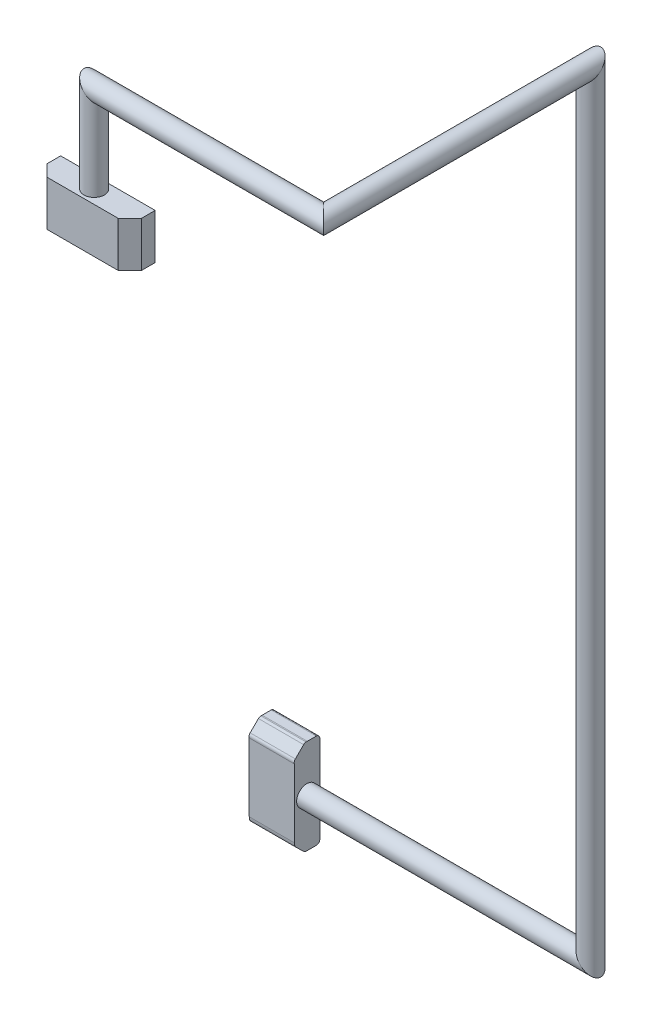
ISO-10303-21;
HEADER;
FILE_DESCRIPTION(('STEP AP214'),'2;1');
FILE_NAME('part.step','',(''),(''),'','','');
FILE_SCHEMA(('AUTOMOTIVE_DESIGN { 1 0 10303 214 1 1 1 1 }'));
ENDSEC;
DATA;
#1=APPLICATION_CONTEXT('core data for automotive mechanical design processes');
#2=APPLICATION_PROTOCOL_DEFINITION('international standard','automotive_design',2000,#1);
#3=PRODUCT_CONTEXT('',#1,'mechanical');
#4=PRODUCT('Part','Part','',(#3));
#5=PRODUCT_RELATED_PRODUCT_CATEGORY('part','',(#4));
#6=PRODUCT_DEFINITION_FORMATION('','',#4);
#7=PRODUCT_DEFINITION_CONTEXT('part definition',#1,'design');
#8=PRODUCT_DEFINITION('design','',#6,#7);
#9=PRODUCT_DEFINITION_SHAPE('','',#8);
#10=(LENGTH_UNIT() NAMED_UNIT(*) SI_UNIT(.MILLI.,.METRE.));
#11=(NAMED_UNIT(*) PLANE_ANGLE_UNIT() SI_UNIT($,.RADIAN.));
#12=(NAMED_UNIT(*) SI_UNIT($,.STERADIAN.) SOLID_ANGLE_UNIT());
#13=UNCERTAINTY_MEASURE_WITH_UNIT(LENGTH_MEASURE(1.E-05),#10,'distance_accuracy_value','');
#14=(GEOMETRIC_REPRESENTATION_CONTEXT(3) GLOBAL_UNCERTAINTY_ASSIGNED_CONTEXT((#13)) GLOBAL_UNIT_ASSIGNED_CONTEXT((#10,
#11,#12)) REPRESENTATION_CONTEXT('',''));
#15=CARTESIAN_POINT('',(0.,0.,0.));
#16=DIRECTION('',(0.,0.,1.));
#17=DIRECTION('',(1.,0.,0.));
#18=AXIS2_PLACEMENT_3D('',#15,#16,#17);
#19=CARTESIAN_POINT('',(3.95000000000001,57.485,19.48));
#20=DIRECTION('',(0.,-1.,0.));
#21=DIRECTION('',(0.,0.,-1.));
#22=AXIS2_PLACEMENT_3D('',#19,#20,#21);
#23=CYLINDRICAL_SURFACE('',#22,0.75);
#24=CARTESIAN_POINT('',(3.95000000000001,56.56,19.48));
#25=DIRECTION('',(-0.707106781186548,-0.707106781186548,0.));
#26=DIRECTION('',(-0.707106781186548,0.707106781186548,0.));
#27=AXIS2_PLACEMENT_3D('',#24,#25,#26);
#28=ELLIPSE('',#27,1.06066017177982,0.75);
#29=CARTESIAN_POINT('',(3.20000000000001,57.31,19.48));
#30=VERTEX_POINT('',#29);
#31=EDGE_CURVE('E243',#30,#30,#28,.F.);
#32=ORIENTED_EDGE('',*,*,#31,.F.);
#33=EDGE_LOOP('',(#32));
#34=FACE_BOUND('',#33,.T.);
#35=CARTESIAN_POINT('',(3.95000000000001,50.06,19.48));
#36=DIRECTION('',(0.,-1.,0.));
#37=DIRECTION('',(-1.,0.,0.));
#38=AXIS2_PLACEMENT_3D('',#35,#36,#37);
#39=CIRCLE('',#38,0.75);
#40=CARTESIAN_POINT('',(3.20000000000001,50.06,19.48));
#41=VERTEX_POINT('',#40);
#42=EDGE_CURVE('E46',#41,#41,#39,.T.);
#43=ORIENTED_EDGE('',*,*,#42,.F.);
#44=EDGE_LOOP('',(#43));
#45=FACE_BOUND('',#44,.T.);
#46=ADVANCED_FACE('F43',(#34,#45),#23,.T.);
#47=CARTESIAN_POINT('',(22.46,56.56,19.48));
#48=DIRECTION('',(-1.,0.,0.));
#49=DIRECTION('',(0.,0.,1.));
#50=AXIS2_PLACEMENT_3D('',#47,#48,#49);
#51=CYLINDRICAL_SURFACE('',#50,0.75);
#52=CARTESIAN_POINT('',(20.71,56.56,19.48));
#53=DIRECTION('',(-0.707106781186548,0.,0.707106781186547));
#54=DIRECTION('',(0.707106781186547,0.,0.707106781186548));
#55=AXIS2_PLACEMENT_3D('',#52,#53,#54);
#56=ELLIPSE('',#55,1.06066017177982,0.75);
#57=CARTESIAN_POINT('',(21.46,56.56,20.23));
#58=VERTEX_POINT('',#57);
#59=EDGE_CURVE('E241',#58,#58,#56,.F.);
#60=ORIENTED_EDGE('',*,*,#59,.F.);
#61=EDGE_LOOP('',(#60));
#62=FACE_BOUND('',#61,.T.);
#63=ORIENTED_EDGE('',*,*,#31,.T.);
#64=EDGE_LOOP('',(#63));
#65=FACE_BOUND('',#64,.T.);
#66=ADVANCED_FACE('F254',(#62,#65),#51,.T.);
#67=CARTESIAN_POINT('',(20.71,56.56,-0.924999999999992));
#68=DIRECTION('',(0.,0.,1.));
#69=DIRECTION('',(1.,0.,0.));
#70=AXIS2_PLACEMENT_3D('',#67,#68,#69);
#71=CYLINDRICAL_SURFACE('',#70,0.75);
#72=CARTESIAN_POINT('',(20.71,56.56,0.));
#73=DIRECTION('',(0.,0.707106781186548,0.707106781186548));
#74=DIRECTION('',(0.,0.707106781186548,-0.707106781186548));
#75=AXIS2_PLACEMENT_3D('',#72,#73,#74);
#76=ELLIPSE('',#75,1.06066017177982,0.75);
#77=CARTESIAN_POINT('',(20.71,57.31,-0.75));
#78=VERTEX_POINT('',#77);
#79=EDGE_CURVE('E52',#78,#78,#76,.F.);
#80=ORIENTED_EDGE('',*,*,#79,.F.);
#81=EDGE_LOOP('',(#80));
#82=FACE_BOUND('',#81,.T.);
#83=ORIENTED_EDGE('',*,*,#59,.T.);
#84=EDGE_LOOP('',(#83));
#85=FACE_BOUND('',#84,.T.);
#86=ADVANCED_FACE('F260',(#82,#85),#71,.T.);
#87=CARTESIAN_POINT('',(20.71,-1.75,0.));
#88=DIRECTION('',(0.,1.,0.));
#89=DIRECTION('',(0.,0.,1.));
#90=AXIS2_PLACEMENT_3D('',#87,#88,#89);
#91=CYLINDRICAL_SURFACE('',#90,0.75);
#92=CARTESIAN_POINT('',(20.71,0.,0.));
#93=DIRECTION('',(0.707106781186548,0.707106781186548,0.));
#94=DIRECTION('',(0.707106781186548,-0.707106781186548,0.));
#95=AXIS2_PLACEMENT_3D('',#92,#93,#94);
#96=ELLIPSE('',#95,1.06066017177982,0.75);
#97=CARTESIAN_POINT('',(21.46,-0.75,0.));
#98=VERTEX_POINT('',#97);
#99=EDGE_CURVE('E11',#98,#98,#96,.F.);
#100=ORIENTED_EDGE('',*,*,#99,.F.);
#101=EDGE_LOOP('',(#100));
#102=FACE_BOUND('',#101,.T.);
#103=ORIENTED_EDGE('',*,*,#79,.T.);
#104=EDGE_LOOP('',(#103));
#105=FACE_BOUND('',#104,.T.);
#106=ADVANCED_FACE('F267',(#102,#105),#91,.T.);
#107=CARTESIAN_POINT('',(0.,0.,0.));
#108=DIRECTION('',(1.,0.,0.));
#109=DIRECTION('',(0.,0.,-1.));
#110=AXIS2_PLACEMENT_3D('',#107,#108,#109);
#111=CYLINDRICAL_SURFACE('',#110,0.75);
#112=CARTESIAN_POINT('',(0.,0.,0.));
#113=DIRECTION('',(1.,0.,0.));
#114=DIRECTION('',(0.,0.,-1.));
#115=AXIS2_PLACEMENT_3D('',#112,#113,#114);
#116=CIRCLE('',#115,0.75);
#117=CARTESIAN_POINT('',(0.,0.,-0.75));
#118=VERTEX_POINT('',#117);
#119=EDGE_CURVE('E217',#118,#118,#116,.T.);
#120=ORIENTED_EDGE('',*,*,#119,.T.);
#121=EDGE_LOOP('',(#120));
#122=FACE_BOUND('',#121,.T.);
#123=ORIENTED_EDGE('',*,*,#99,.T.);
#124=EDGE_LOOP('',(#123));
#125=FACE_BOUND('',#124,.T.);
#126=ADVANCED_FACE('F264',(#122,#125),#111,.T.);
#127=CARTESIAN_POINT('',(-3.3,3.14279483130791,-0.674720463481326));
#128=DIRECTION('',(1.,0.,0.));
#129=DIRECTION('',(0.,0.,-1.));
#130=AXIS2_PLACEMENT_3D('',#127,#128,#129);
#131=CYLINDRICAL_SURFACE('',#130,0.268839190446714);
#132=CARTESIAN_POINT('',(0.,3.14279483130791,-0.674720463481326));
#133=DIRECTION('',(1.,0.,0.));
#134=DIRECTION('',(0.,0.,-1.));
#135=AXIS2_PLACEMENT_3D('',#132,#133,#134);
#136=CIRCLE('',#135,0.268839190446714);
#137=CARTESIAN_POINT('',(0.,3.14279483130791,-0.94355965392804));
#138=VERTEX_POINT('',#137);
#139=CARTESIAN_POINT('',(0.,3.41097312130053,-0.69355965392779));
#140=VERTEX_POINT('',#139);
#141=EDGE_CURVE('E178',#138,#140,#136,.T.);
#142=ORIENTED_EDGE('',*,*,#141,.F.);
#143=DIRECTION('',(1.,0.,0.));
#144=VECTOR('',#143,1.);
#145=CARTESIAN_POINT('',(-3.3,3.14279483130791,-0.94355965392804));
#146=LINE('',#145,#144);
#147=CARTESIAN_POINT('',(-3.3,3.14279483130791,-0.94355965392804));
#148=VERTEX_POINT('',#147);
#149=EDGE_CURVE('E61',#148,#138,#146,.T.);
#150=ORIENTED_EDGE('',*,*,#149,.F.);
#151=CARTESIAN_POINT('',(-3.3,3.14279483130791,-0.674720463481326));
#152=DIRECTION('',(1.,0.,0.));
#153=DIRECTION('',(0.,0.,-1.));
#154=AXIS2_PLACEMENT_3D('',#151,#152,#153);
#155=CIRCLE('',#154,0.268839190446714);
#156=CARTESIAN_POINT('',(-3.3,3.41097312130053,-0.69355965392779));
#157=VERTEX_POINT('',#156);
#158=EDGE_CURVE('E215',#148,#157,#155,.T.);
#159=ORIENTED_EDGE('',*,*,#158,.T.);
#160=DIRECTION('',(1.,0.,0.));
#161=VECTOR('',#160,1.);
#162=CARTESIAN_POINT('',(-3.3,3.41097312130053,-0.69355965392779));
#163=LINE('',#162,#161);
#164=EDGE_CURVE('E118',#157,#140,#163,.T.);
#165=ORIENTED_EDGE('',*,*,#164,.T.);
#166=EDGE_LOOP('',(#142,#150,#159,#165));
#167=FACE_BOUND('',#166,.T.);
#168=ADVANCED_FACE('F256',(#167),#131,.T.);
#169=CARTESIAN_POINT('',(-3.3,-3.2391993437757,-0.94355965392804));
#170=DIRECTION('',(0.,0.,-1.));
#171=DIRECTION('',(-1.,0.,0.));
#172=AXIS2_PLACEMENT_3D('',#169,#170,#171);
#173=PLANE('',#172);
#174=DIRECTION('',(0.,1.,0.));
#175=VECTOR('',#174,1.);
#176=CARTESIAN_POINT('',(0.,-3.2391993437757,-0.94355965392804));
#177=LINE('',#176,#175);
#178=CARTESIAN_POINT('',(0.,-3.2391993437757,-0.94355965392804));
#179=VERTEX_POINT('',#178);
#180=EDGE_CURVE('E212',#179,#138,#177,.T.);
#181=ORIENTED_EDGE('',*,*,#180,.F.);
#182=DIRECTION('',(1.,0.,0.));
#183=VECTOR('',#182,1.);
#184=CARTESIAN_POINT('',(-3.3,-3.2391993437757,-0.94355965392804));
#185=LINE('',#184,#183);
#186=CARTESIAN_POINT('',(-3.3,-3.2391993437757,-0.94355965392804));
#187=VERTEX_POINT('',#186);
#188=EDGE_CURVE('E106',#187,#179,#185,.T.);
#189=ORIENTED_EDGE('',*,*,#188,.F.);
#190=DIRECTION('',(0.,1.,0.));
#191=VECTOR('',#190,1.);
#192=CARTESIAN_POINT('',(-3.3,-3.2391993437757,-0.94355965392804));
#193=LINE('',#192,#191);
#194=EDGE_CURVE('E168',#187,#148,#193,.T.);
#195=ORIENTED_EDGE('',*,*,#194,.T.);
#196=ORIENTED_EDGE('',*,*,#149,.T.);
#197=EDGE_LOOP('',(#181,#189,#195,#196));
#198=FACE_BOUND('',#197,.T.);
#199=ADVANCED_FACE('F263',(#198),#173,.T.);
#200=CARTESIAN_POINT('',(-3.3,-3.2391993437757,-0.683559653928047));
#201=DIRECTION('',(1.,0.,0.));
#202=DIRECTION('',(0.,0.,-1.));
#203=AXIS2_PLACEMENT_3D('',#200,#201,#202);
#204=CYLINDRICAL_SURFACE('',#203,0.259999999999993);
#205=CARTESIAN_POINT('',(0.,-3.2391993437757,-0.683559653928047));
#206=DIRECTION('',(1.,0.,0.));
#207=DIRECTION('',(0.,0.,-1.));
#208=AXIS2_PLACEMENT_3D('',#205,#206,#207);
#209=CIRCLE('',#208,0.259999999999993);
#210=CARTESIAN_POINT('',(0.,-3.49919934377569,-0.683559653928047));
#211=VERTEX_POINT('',#210);
#212=EDGE_CURVE('E155',#211,#179,#209,.T.);
#213=ORIENTED_EDGE('',*,*,#212,.F.);
#214=DIRECTION('',(1.,0.,0.));
#215=VECTOR('',#214,1.);
#216=CARTESIAN_POINT('',(-3.3,-3.49919934377569,-0.683559653928047));
#217=LINE('',#216,#215);
#218=CARTESIAN_POINT('',(-3.3,-3.49919934377569,-0.683559653928047));
#219=VERTEX_POINT('',#218);
#220=EDGE_CURVE('E150',#219,#211,#217,.T.);
#221=ORIENTED_EDGE('',*,*,#220,.F.);
#222=CARTESIAN_POINT('',(-3.3,-3.2391993437757,-0.683559653928047));
#223=DIRECTION('',(1.,0.,0.));
#224=DIRECTION('',(0.,0.,-1.));
#225=AXIS2_PLACEMENT_3D('',#222,#223,#224);
#226=CIRCLE('',#225,0.259999999999993);
#227=EDGE_CURVE('E153',#219,#187,#226,.T.);
#228=ORIENTED_EDGE('',*,*,#227,.T.);
#229=ORIENTED_EDGE('',*,*,#188,.T.);
#230=EDGE_LOOP('',(#213,#221,#228,#229));
#231=FACE_BOUND('',#230,.T.);
#232=ADVANCED_FACE('F152',(#231),#204,.T.);
#233=CARTESIAN_POINT('',(-3.3,-3.49919934377569,0.0528869554802396));
#234=DIRECTION('',(0.,-1.,0.));
#235=DIRECTION('',(0.,0.,-1.));
#236=AXIS2_PLACEMENT_3D('',#233,#234,#235);
#237=PLANE('',#236);
#238=DIRECTION('',(0.,0.,-1.));
#239=VECTOR('',#238,1.);
#240=CARTESIAN_POINT('',(0.,-3.49919934377569,0.0528869554802396));
#241=LINE('',#240,#239);
#242=CARTESIAN_POINT('',(0.,-3.49919934377569,0.0528869554802397));
#243=VERTEX_POINT('',#242);
#244=EDGE_CURVE('E209',#243,#211,#241,.T.);
#245=ORIENTED_EDGE('',*,*,#244,.F.);
#246=DIRECTION('',(1.,0.,0.));
#247=VECTOR('',#246,1.);
#248=CARTESIAN_POINT('',(-3.3,-3.49919934377569,0.0528869554802397));
#249=LINE('',#248,#247);
#250=CARTESIAN_POINT('',(-3.3,-3.49919934377569,0.0528869554802397));
#251=VERTEX_POINT('',#250);
#252=EDGE_CURVE('E160',#251,#243,#249,.T.);
#253=ORIENTED_EDGE('',*,*,#252,.F.);
#254=DIRECTION('',(0.,0.,-1.));
#255=VECTOR('',#254,1.);
#256=CARTESIAN_POINT('',(-3.3,-3.49919934377569,0.0528869554802396));
#257=LINE('',#256,#255);
#258=EDGE_CURVE('E166',#251,#219,#257,.T.);
#259=ORIENTED_EDGE('',*,*,#258,.T.);
#260=ORIENTED_EDGE('',*,*,#220,.T.);
#261=EDGE_LOOP('',(#245,#253,#259,#260));
#262=FACE_BOUND('',#261,.T.);
#263=ADVANCED_FACE('F170',(#262),#237,.T.);
#264=CARTESIAN_POINT('',(-3.3,-3.24192245445238,0.0498727692290792));
#265=DIRECTION('',(1.,0.,0.));
#266=DIRECTION('',(0.,0.,-1.));
#267=AXIS2_PLACEMENT_3D('',#264,#265,#266);
#268=CYLINDRICAL_SURFACE('',#267,0.25729454541174);
#269=CARTESIAN_POINT('',(0.,-3.24192245445238,0.0498727692290792));
#270=DIRECTION('',(1.,0.,0.));
#271=DIRECTION('',(0.,0.,-1.));
#272=AXIS2_PLACEMENT_3D('',#269,#270,#271);
#273=CIRCLE('',#272,0.25729454541174);
#274=CARTESIAN_POINT('',(0.,-3.42597603907235,0.229663650775321));
#275=VERTEX_POINT('',#274);
#276=EDGE_CURVE('E206',#275,#243,#273,.T.);
#277=ORIENTED_EDGE('',*,*,#276,.F.);
#278=DIRECTION('',(1.,0.,0.));
#279=VECTOR('',#278,1.);
#280=CARTESIAN_POINT('',(-3.3,-3.42597603907235,0.229663650775321));
#281=LINE('',#280,#279);
#282=CARTESIAN_POINT('',(-3.3,-3.42597603907235,0.229663650775321));
#283=VERTEX_POINT('',#282);
#284=EDGE_CURVE('E220',#283,#275,#281,.T.);
#285=ORIENTED_EDGE('',*,*,#284,.F.);
#286=CARTESIAN_POINT('',(-3.3,-3.24192245445238,0.0498727692290792));
#287=DIRECTION('',(1.,0.,0.));
#288=DIRECTION('',(0.,0.,-1.));
#289=AXIS2_PLACEMENT_3D('',#286,#287,#288);
#290=CIRCLE('',#289,0.25729454541174);
#291=EDGE_CURVE('E171',#283,#251,#290,.T.);
#292=ORIENTED_EDGE('',*,*,#291,.T.);
#293=ORIENTED_EDGE('',*,*,#252,.T.);
#294=EDGE_LOOP('',(#277,#285,#292,#293));
#295=FACE_BOUND('',#294,.T.);
#296=ADVANCED_FACE('F329',(#295),#268,.T.);
#297=CARTESIAN_POINT('',(-3.3,-2.82949371629076,0.840288109180672));
#298=DIRECTION('',(0.,-0.715341960807725,0.698774555280713));
#299=DIRECTION('',(0.,-0.698774555280713,-0.715341960807725));
#300=AXIS2_PLACEMENT_3D('',#297,#298,#299);
#301=PLANE('',#300);
#302=DIRECTION('',(0.,-0.698774555280713,-0.715341960807725));
#303=VECTOR('',#302,1.);
#304=CARTESIAN_POINT('',(0.,-2.82949371629076,0.840288109180672));
#305=LINE('',#304,#303);
#306=CARTESIAN_POINT('',(0.,-2.82949371629076,0.840288109180672));
#307=VERTEX_POINT('',#306);
#308=EDGE_CURVE('E203',#307,#275,#305,.T.);
#309=ORIENTED_EDGE('',*,*,#308,.F.);
#310=DIRECTION('',(1.,0.,0.));
#311=VECTOR('',#310,1.);
#312=CARTESIAN_POINT('',(-3.3,-2.82949371629076,0.840288109180672));
#313=LINE('',#312,#311);
#314=CARTESIAN_POINT('',(-3.3,-2.82949371629076,0.840288109180672));
#315=VERTEX_POINT('',#314);
#316=EDGE_CURVE('E222',#315,#307,#313,.T.);
#317=ORIENTED_EDGE('',*,*,#316,.F.);
#318=DIRECTION('',(0.,-0.698774555280713,-0.715341960807725));
#319=VECTOR('',#318,1.);
#320=CARTESIAN_POINT('',(-3.3,-2.82949371629076,0.840288109180672));
#321=LINE('',#320,#319);
#322=EDGE_CURVE('E173',#315,#283,#321,.T.);
#323=ORIENTED_EDGE('',*,*,#322,.T.);
#324=ORIENTED_EDGE('',*,*,#284,.T.);
#325=EDGE_LOOP('',(#309,#317,#323,#324));
#326=FACE_BOUND('',#325,.T.);
#327=ADVANCED_FACE('F338',(#326),#301,.T.);
#328=CARTESIAN_POINT('',(-3.3,-2.54306493072026,0.266257007374513));
#329=DIRECTION('',(1.,0.,0.));
#330=DIRECTION('',(0.,0.,-1.));
#331=AXIS2_PLACEMENT_3D('',#328,#329,#330);
#332=CYLINDRICAL_SURFACE('',#331,0.641524087657032);
#333=CARTESIAN_POINT('',(0.,-2.54306493072026,0.266257007374513));
#334=DIRECTION('',(1.,0.,0.));
#335=DIRECTION('',(0.,0.,-1.));
#336=AXIS2_PLACEMENT_3D('',#333,#334,#335);
#337=CIRCLE('',#336,0.641524087657032);
#338=CARTESIAN_POINT('',(0.,-2.54419934377573,0.907780092034143));
#339=VERTEX_POINT('',#338);
#340=EDGE_CURVE('E200',#339,#307,#337,.T.);
#341=ORIENTED_EDGE('',*,*,#340,.F.);
#342=DIRECTION('',(1.,0.,0.));
#343=VECTOR('',#342,1.);
#344=CARTESIAN_POINT('',(-3.3,-2.54419934377573,0.907780092034143));
#345=LINE('',#344,#343);
#346=CARTESIAN_POINT('',(-3.3,-2.54419934377573,0.907780092034143));
#347=VERTEX_POINT('',#346);
#348=EDGE_CURVE('E224',#347,#339,#345,.T.);
#349=ORIENTED_EDGE('',*,*,#348,.F.);
#350=CARTESIAN_POINT('',(-3.3,-2.54306493072026,0.266257007374513));
#351=DIRECTION('',(1.,0.,0.));
#352=DIRECTION('',(0.,0.,-1.));
#353=AXIS2_PLACEMENT_3D('',#350,#351,#352);
#354=CIRCLE('',#353,0.641524087657032);
#355=EDGE_CURVE('E616',#347,#315,#354,.T.);
#356=ORIENTED_EDGE('',*,*,#355,.T.);
#357=ORIENTED_EDGE('',*,*,#316,.T.);
#358=EDGE_LOOP('',(#341,#349,#356,#357));
#359=FACE_BOUND('',#358,.T.);
#360=ADVANCED_FACE('F348',(#359),#332,.T.);
#361=CARTESIAN_POINT('',(-3.3,2.45080065622412,0.916612811148371));
#362=DIRECTION('',(0.,-0.00176830937029501,0.999998436539763));
#363=DIRECTION('',(0.,-0.999998436539763,-0.00176830937029501));
#364=AXIS2_PLACEMENT_3D('',#361,#362,#363);
#365=PLANE('',#364);
#366=DIRECTION('',(0.,-0.999998436539763,-0.00176830937029501));
#367=VECTOR('',#366,1.);
#368=CARTESIAN_POINT('',(0.,2.45080065622412,0.916612811148371));
#369=LINE('',#368,#367);
#370=CARTESIAN_POINT('',(0.,2.45080065622412,0.916612811148371));
#371=VERTEX_POINT('',#370);
#372=EDGE_CURVE('E197',#371,#339,#369,.T.);
#373=ORIENTED_EDGE('',*,*,#372,.F.);
#374=DIRECTION('',(1.,0.,0.));
#375=VECTOR('',#374,1.);
#376=CARTESIAN_POINT('',(-3.3,2.45080065622412,0.916612811148371));
#377=LINE('',#376,#375);
#378=CARTESIAN_POINT('',(-3.3,2.45080065622412,0.916612811148371));
#379=VERTEX_POINT('',#378);
#380=EDGE_CURVE('E226',#379,#371,#377,.T.);
#381=ORIENTED_EDGE('',*,*,#380,.F.);
#382=DIRECTION('',(0.,-0.999998436539763,-0.00176830937029501));
#383=VECTOR('',#382,1.);
#384=CARTESIAN_POINT('',(-3.3,2.45080065622412,0.916612811148371));
#385=LINE('',#384,#383);
#386=EDGE_CURVE('E613',#379,#347,#385,.T.);
#387=ORIENTED_EDGE('',*,*,#386,.T.);
#388=ORIENTED_EDGE('',*,*,#348,.T.);
#389=EDGE_LOOP('',(#373,#381,#387,#388));
#390=FACE_BOUND('',#389,.T.);
#391=ADVANCED_FACE('F358',(#390),#365,.T.);
#392=CARTESIAN_POINT('',(-3.3,2.52422565210539,0.633418300033272));
#393=DIRECTION('',(1.,0.,0.));
#394=DIRECTION('',(0.,0.,-1.));
#395=AXIS2_PLACEMENT_3D('',#392,#393,#394);
#396=CYLINDRICAL_SURFACE('',#395,0.29255830384025);
#397=CARTESIAN_POINT('',(0.,2.52422565210539,0.633418300033272));
#398=DIRECTION('',(1.,0.,0.));
#399=DIRECTION('',(0.,0.,-1.));
#400=AXIS2_PLACEMENT_3D('',#397,#398,#399);
#401=CIRCLE('',#400,0.29255830384025);
#402=CARTESIAN_POINT('',(0.,2.73109561264326,0.840288260571147));
#403=VERTEX_POINT('',#402);
#404=EDGE_CURVE('E194',#403,#371,#401,.T.);
#405=ORIENTED_EDGE('',*,*,#404,.F.);
#406=DIRECTION('',(1.,0.,0.));
#407=VECTOR('',#406,1.);
#408=CARTESIAN_POINT('',(-3.3,2.73109561264326,0.840288260571147));
#409=LINE('',#408,#407);
#410=CARTESIAN_POINT('',(-3.3,2.73109561264326,0.840288260571147));
#411=VERTEX_POINT('',#410);
#412=EDGE_CURVE('E228',#411,#403,#409,.T.);
#413=ORIENTED_EDGE('',*,*,#412,.F.);
#414=CARTESIAN_POINT('',(-3.3,2.52422565210539,0.633418300033272));
#415=DIRECTION('',(1.,0.,0.));
#416=DIRECTION('',(0.,0.,-1.));
#417=AXIS2_PLACEMENT_3D('',#414,#415,#416);
#418=CIRCLE('',#417,0.29255830384025);
#419=EDGE_CURVE('E610',#411,#379,#418,.T.);
#420=ORIENTED_EDGE('',*,*,#419,.T.);
#421=ORIENTED_EDGE('',*,*,#380,.T.);
#422=EDGE_LOOP('',(#405,#413,#420,#421));
#423=FACE_BOUND('',#422,.T.);
#424=ADVANCED_FACE('F368',(#423),#396,.T.);
#425=CARTESIAN_POINT('',(-3.3,3.33428022683429,0.237103646380121));
#426=DIRECTION('',(0.,0.707106781186548,0.707106781186547));
#427=DIRECTION('',(0.,-0.707106781186547,0.707106781186548));
#428=AXIS2_PLACEMENT_3D('',#425,#426,#427);
#429=PLANE('',#428);
#430=DIRECTION('',(0.,-0.707106781186547,0.707106781186548));
#431=VECTOR('',#430,1.);
#432=CARTESIAN_POINT('',(0.,3.33428022683429,0.237103646380121));
#433=LINE('',#432,#431);
#434=CARTESIAN_POINT('',(0.,3.33428022683429,0.237103646380121));
#435=VERTEX_POINT('',#434);
#436=EDGE_CURVE('E191',#435,#403,#433,.T.);
#437=ORIENTED_EDGE('',*,*,#436,.F.);
#438=DIRECTION('',(1.,0.,0.));
#439=VECTOR('',#438,1.);
#440=CARTESIAN_POINT('',(-3.3,3.33428022683429,0.237103646380121));
#441=LINE('',#440,#439);
#442=CARTESIAN_POINT('',(-3.3,3.33428022683429,0.237103646380121));
#443=VERTEX_POINT('',#442);
#444=EDGE_CURVE('E230',#443,#435,#441,.T.);
#445=ORIENTED_EDGE('',*,*,#444,.F.);
#446=DIRECTION('',(0.,-0.707106781186547,0.707106781186548));
#447=VECTOR('',#446,1.);
#448=CARTESIAN_POINT('',(-3.3,3.33428022683429,0.237103646380121));
#449=LINE('',#448,#447);
#450=EDGE_CURVE('E607',#443,#411,#449,.T.);
#451=ORIENTED_EDGE('',*,*,#450,.T.);
#452=ORIENTED_EDGE('',*,*,#412,.T.);
#453=EDGE_LOOP('',(#437,#445,#451,#452));
#454=FACE_BOUND('',#453,.T.);
#455=ADVANCED_FACE('F378',(#454),#429,.T.);
#456=CARTESIAN_POINT('',(-3.3,3.14954231317661,0.0523657327224404));
#457=DIRECTION('',(1.,0.,0.));
#458=DIRECTION('',(0.,0.,-1.));
#459=AXIS2_PLACEMENT_3D('',#456,#457,#458);
#460=CYLINDRICAL_SURFACE('',#459,0.261258862979202);
#461=CARTESIAN_POINT('',(0.,3.14954231317661,0.0523657327224404));
#462=DIRECTION('',(1.,0.,0.));
#463=DIRECTION('',(0.,0.,-1.));
#464=AXIS2_PLACEMENT_3D('',#461,#462,#463);
#465=CIRCLE('',#464,0.261258862979202);
#466=CARTESIAN_POINT('',(0.,3.41080065622429,0.0528869554789198));
#467=VERTEX_POINT('',#466);
#468=EDGE_CURVE('E188',#467,#435,#465,.T.);
#469=ORIENTED_EDGE('',*,*,#468,.F.);
#470=DIRECTION('',(1.,0.,0.));
#471=VECTOR('',#470,1.);
#472=CARTESIAN_POINT('',(-3.3,3.41080065622429,0.0528869554789198));
#473=LINE('',#472,#471);
#474=CARTESIAN_POINT('',(-3.3,3.41080065622429,0.0528869554789198));
#475=VERTEX_POINT('',#474);
#476=EDGE_CURVE('E232',#475,#467,#473,.T.);
#477=ORIENTED_EDGE('',*,*,#476,.F.);
#478=CARTESIAN_POINT('',(-3.3,3.14954231317661,0.0523657327224404));
#479=DIRECTION('',(1.,0.,0.));
#480=DIRECTION('',(0.,0.,-1.));
#481=AXIS2_PLACEMENT_3D('',#478,#479,#480);
#482=CIRCLE('',#481,0.261258862979202);
#483=EDGE_CURVE('E604',#475,#443,#482,.T.);
#484=ORIENTED_EDGE('',*,*,#483,.T.);
#485=ORIENTED_EDGE('',*,*,#444,.T.);
#486=EDGE_LOOP('',(#469,#477,#484,#485));
#487=FACE_BOUND('',#486,.T.);
#488=ADVANCED_FACE('F388',(#487),#460,.T.);
#489=CARTESIAN_POINT('',(-3.3,3.41097312130053,-0.0335596539417225));
#490=DIRECTION('',(0.,0.999998009899041,0.00199504334718355));
#491=DIRECTION('',(0.,-0.00199504334718355,0.999998009899041));
#492=AXIS2_PLACEMENT_3D('',#489,#490,#491);
#493=PLANE('',#492);
#494=DIRECTION('',(0.,-0.00199504334718355,0.999998009899041));
#495=VECTOR('',#494,1.);
#496=CARTESIAN_POINT('',(0.,3.41097312130053,-0.0335596539417225));
#497=LINE('',#496,#495);
#498=CARTESIAN_POINT('',(0.,3.41097312130053,-0.0335596539417225));
#499=VERTEX_POINT('',#498);
#500=EDGE_CURVE('E185',#499,#467,#497,.T.);
#501=ORIENTED_EDGE('',*,*,#500,.F.);
#502=DIRECTION('',(1.,0.,0.));
#503=VECTOR('',#502,1.);
#504=CARTESIAN_POINT('',(-3.3,3.41097312130053,-0.0335596539417225));
#505=LINE('',#504,#503);
#506=CARTESIAN_POINT('',(-3.3,3.41097312130053,-0.0335596539417225));
#507=VERTEX_POINT('',#506);
#508=EDGE_CURVE('E234',#507,#499,#505,.T.);
#509=ORIENTED_EDGE('',*,*,#508,.F.);
#510=DIRECTION('',(0.,-0.00199504334718355,0.999998009899041));
#511=VECTOR('',#510,1.);
#512=CARTESIAN_POINT('',(-3.3,3.41097312130053,-0.0335596539417225));
#513=LINE('',#512,#511);
#514=EDGE_CURVE('E601',#507,#475,#513,.T.);
#515=ORIENTED_EDGE('',*,*,#514,.T.);
#516=ORIENTED_EDGE('',*,*,#476,.T.);
#517=EDGE_LOOP('',(#501,#509,#515,#516));
#518=FACE_BOUND('',#517,.T.);
#519=ADVANCED_FACE('F398',(#518),#493,.T.);
#520=CARTESIAN_POINT('',(-3.3,3.41097312130053,-0.69355965392779));
#521=DIRECTION('',(0.,1.,0.));
#522=DIRECTION('',(0.,0.,1.));
#523=AXIS2_PLACEMENT_3D('',#520,#521,#522);
#524=PLANE('',#523);
#525=DIRECTION('',(0.,0.,1.));
#526=VECTOR('',#525,1.);
#527=CARTESIAN_POINT('',(0.,3.41097312130053,-0.69355965392779));
#528=LINE('',#527,#526);
#529=EDGE_CURVE('E181',#140,#499,#528,.T.);
#530=ORIENTED_EDGE('',*,*,#529,.F.);
#531=ORIENTED_EDGE('',*,*,#164,.F.);
#532=DIRECTION('',(0.,0.,1.));
#533=VECTOR('',#532,1.);
#534=CARTESIAN_POINT('',(-3.3,3.41097312130053,-0.69355965392779));
#535=LINE('',#534,#533);
#536=EDGE_CURVE('E599',#157,#507,#535,.T.);
#537=ORIENTED_EDGE('',*,*,#536,.T.);
#538=ORIENTED_EDGE('',*,*,#508,.T.);
#539=EDGE_LOOP('',(#530,#531,#537,#538));
#540=FACE_BOUND('',#539,.T.);
#541=ADVANCED_FACE('F408',(#540),#524,.T.);
#542=CARTESIAN_POINT('',(-3.3,3.14279483130791,-0.674720463481326));
#543=DIRECTION('',(1.,0.,0.));
#544=DIRECTION('',(0.,0.,-1.));
#545=AXIS2_PLACEMENT_3D('',#542,#543,#544);
#546=PLANE('',#545);
#547=ORIENTED_EDGE('',*,*,#158,.F.);
#548=ORIENTED_EDGE('',*,*,#194,.F.);
#549=ORIENTED_EDGE('',*,*,#227,.F.);
#550=ORIENTED_EDGE('',*,*,#258,.F.);
#551=ORIENTED_EDGE('',*,*,#291,.F.);
#552=ORIENTED_EDGE('',*,*,#322,.F.);
#553=ORIENTED_EDGE('',*,*,#355,.F.);
#554=ORIENTED_EDGE('',*,*,#386,.F.);
#555=ORIENTED_EDGE('',*,*,#419,.F.);
#556=ORIENTED_EDGE('',*,*,#450,.F.);
#557=ORIENTED_EDGE('',*,*,#483,.F.);
#558=ORIENTED_EDGE('',*,*,#514,.F.);
#559=ORIENTED_EDGE('',*,*,#536,.F.);
#560=EDGE_LOOP('',(#547,#548,#549,#550,#551,#552,#553,#554,#555,#556,#557,#558,#559));
#561=FACE_BOUND('',#560,.T.);
#562=ADVANCED_FACE('F164',(#561),#546,.F.);
#563=CARTESIAN_POINT('',(0.,3.14279483130791,-0.674720463481326));
#564=DIRECTION('',(1.,0.,0.));
#565=DIRECTION('',(0.,0.,-1.));
#566=AXIS2_PLACEMENT_3D('',#563,#564,#565);
#567=PLANE('',#566);
#568=ORIENTED_EDGE('',*,*,#119,.F.);
#569=EDGE_LOOP('',(#568));
#570=FACE_BOUND('',#569,.T.);
#571=ORIENTED_EDGE('',*,*,#141,.T.);
#572=ORIENTED_EDGE('',*,*,#529,.T.);
#573=ORIENTED_EDGE('',*,*,#500,.T.);
#574=ORIENTED_EDGE('',*,*,#468,.T.);
#575=ORIENTED_EDGE('',*,*,#436,.T.);
#576=ORIENTED_EDGE('',*,*,#404,.T.);
#577=ORIENTED_EDGE('',*,*,#372,.T.);
#578=ORIENTED_EDGE('',*,*,#340,.T.);
#579=ORIENTED_EDGE('',*,*,#308,.T.);
#580=ORIENTED_EDGE('',*,*,#276,.T.);
#581=ORIENTED_EDGE('',*,*,#244,.T.);
#582=ORIENTED_EDGE('',*,*,#212,.T.);
#583=ORIENTED_EDGE('',*,*,#180,.T.);
#584=EDGE_LOOP('',(#571,#572,#573,#574,#575,#576,#577,#578,#579,#580,#581,#582,#583));
#585=FACE_BOUND('',#584,.T.);
#586=ADVANCED_FACE('F425',(#570,#585),#567,.T.);
#587=CARTESIAN_POINT('',(0.657684460113999,46.76,19.5882810844995));
#588=DIRECTION('',(0.,1.,0.));
#589=DIRECTION('',(-1.,0.,0.));
#590=AXIS2_PLACEMENT_3D('',#587,#588,#589);
#591=CYLINDRICAL_SURFACE('',#590,0.0338474524401168);
#592=CARTESIAN_POINT('',(0.657684460113999,50.06,19.5882810844995));
#593=DIRECTION('',(0.,-1.,0.));
#594=DIRECTION('',(1.,0.,0.));
#595=AXIS2_PLACEMENT_3D('',#592,#593,#594);
#596=CIRCLE('',#595,0.0338474524401168);
#597=CARTESIAN_POINT('',(0.633809583284691,50.06,19.6122735894348));
#598=VERTEX_POINT('',#597);
#599=CARTESIAN_POINT('',(0.626082703056307,50.06,19.6004045735827));
#600=VERTEX_POINT('',#599);
#601=EDGE_CURVE('E589',#598,#600,#596,.T.);
#602=ORIENTED_EDGE('',*,*,#601,.T.);
#603=DIRECTION('',(0.,1.,0.));
#604=VECTOR('',#603,1.);
#605=CARTESIAN_POINT('',(0.626082703056307,46.76,19.6004045735827));
#606=LINE('',#605,#604);
#607=CARTESIAN_POINT('',(0.626082703056307,46.76,19.6004045735827));
#608=VERTEX_POINT('',#607);
#609=EDGE_CURVE('E182',#608,#600,#606,.T.);
#610=ORIENTED_EDGE('',*,*,#609,.F.);
#611=CARTESIAN_POINT('',(0.657684460113999,46.76,19.5882810844995));
#612=DIRECTION('',(0.,-1.,0.));
#613=DIRECTION('',(1.,0.,0.));
#614=AXIS2_PLACEMENT_3D('',#611,#612,#613);
#615=CIRCLE('',#614,0.0338474524401168);
#616=CARTESIAN_POINT('',(0.633809583284691,46.76,19.6122735894348));
#617=VERTEX_POINT('',#616);
#618=EDGE_CURVE('E570',#617,#608,#615,.T.);
#619=ORIENTED_EDGE('',*,*,#618,.F.);
#620=DIRECTION('',(0.,1.,0.));
#621=VECTOR('',#620,1.);
#622=CARTESIAN_POINT('',(0.633809583284691,46.76,19.6122735894348));
#623=LINE('',#622,#621);
#624=EDGE_CURVE('E658',#617,#598,#623,.T.);
#625=ORIENTED_EDGE('',*,*,#624,.T.);
#626=EDGE_LOOP('',(#602,#610,#619,#625));
#627=FACE_BOUND('',#626,.T.);
#628=ADVANCED_FACE('F434',(#627),#591,.T.);
#629=CARTESIAN_POINT('',(0.626082703056307,46.76,19.6004045735827));
#630=DIRECTION('',(1.,0.,0.));
#631=DIRECTION('',(0.,1.,0.));
#632=AXIS2_PLACEMENT_3D('',#629,#630,#631);
#633=PLANE('',#632);
#634=DIRECTION('',(0.,0.,-1.));
#635=VECTOR('',#634,1.);
#636=CARTESIAN_POINT('',(0.626082703056307,50.06,19.6004045735827));
#637=LINE('',#636,#635);
#638=CARTESIAN_POINT('',(0.626082703056307,50.06,18.6131000997996));
#639=VERTEX_POINT('',#638);
#640=EDGE_CURVE('E686',#600,#639,#637,.T.);
#641=ORIENTED_EDGE('',*,*,#640,.T.);
#642=DIRECTION('',(0.,1.,0.));
#643=VECTOR('',#642,1.);
#644=CARTESIAN_POINT('',(0.626082703056307,46.76,18.6131000997996));
#645=LINE('',#644,#643);
#646=CARTESIAN_POINT('',(0.626082703056307,46.76,18.6131000997996));
#647=VERTEX_POINT('',#646);
#648=EDGE_CURVE('E591',#647,#639,#645,.T.);
#649=ORIENTED_EDGE('',*,*,#648,.F.);
#650=DIRECTION('',(0.,0.,-1.));
#651=VECTOR('',#650,1.);
#652=CARTESIAN_POINT('',(0.626082703056307,46.76,19.6004045735827));
#653=LINE('',#652,#651);
#654=EDGE_CURVE('E575',#608,#647,#653,.T.);
#655=ORIENTED_EDGE('',*,*,#654,.F.);
#656=ORIENTED_EDGE('',*,*,#609,.T.);
#657=EDGE_LOOP('',(#641,#649,#655,#656));
#658=FACE_BOUND('',#657,.T.);
#659=ADVANCED_FACE('F444',(#658),#633,.F.);
#660=CARTESIAN_POINT('',(0.636082703056296,46.76,18.6131000997996));
#661=DIRECTION('',(0.,1.,0.));
#662=DIRECTION('',(-1.,0.,0.));
#663=AXIS2_PLACEMENT_3D('',#660,#661,#662);
#664=CYLINDRICAL_SURFACE('',#663,0.00999999999998924);
#665=CARTESIAN_POINT('',(0.636082703056297,50.06,18.6131000997996));
#666=DIRECTION('',(0.,-1.,0.));
#667=DIRECTION('',(1.,0.,0.));
#668=AXIS2_PLACEMENT_3D('',#665,#666,#667);
#669=CIRCLE('',#668,0.00999999999998924);
#670=CARTESIAN_POINT('',(0.636082703056297,50.06,18.6031000997996));
#671=VERTEX_POINT('',#670);
#672=EDGE_CURVE('E683',#639,#671,#669,.T.);
#673=ORIENTED_EDGE('',*,*,#672,.T.);
#674=DIRECTION('',(0.,1.,0.));
#675=VECTOR('',#674,1.);
#676=CARTESIAN_POINT('',(0.636082703056296,46.76,18.6031000997996));
#677=LINE('',#676,#675);
#678=CARTESIAN_POINT('',(0.636082703056296,46.76,18.6031000997996));
#679=VERTEX_POINT('',#678);
#680=EDGE_CURVE('E594',#679,#671,#677,.T.);
#681=ORIENTED_EDGE('',*,*,#680,.F.);
#682=CARTESIAN_POINT('',(0.636082703056296,46.76,18.6131000997996));
#683=DIRECTION('',(0.,-1.,0.));
#684=DIRECTION('',(1.,0.,0.));
#685=AXIS2_PLACEMENT_3D('',#682,#683,#684);
#686=CIRCLE('',#685,0.00999999999998924);
#687=EDGE_CURVE('E710',#647,#679,#686,.T.);
#688=ORIENTED_EDGE('',*,*,#687,.F.);
#689=ORIENTED_EDGE('',*,*,#648,.T.);
#690=EDGE_LOOP('',(#673,#681,#688,#689));
#691=FACE_BOUND('',#690,.T.);
#692=ADVANCED_FACE('F454',(#691),#664,.T.);
#693=CARTESIAN_POINT('',(0.636082703056296,46.76,18.6031000997996));
#694=DIRECTION('',(0.,0.,1.));
#695=DIRECTION('',(0.,-1.,0.));
#696=AXIS2_PLACEMENT_3D('',#693,#694,#695);
#697=PLANE('',#696);
#698=DIRECTION('',(1.,0.,0.));
#699=VECTOR('',#698,1.);
#700=CARTESIAN_POINT('',(0.636082703056297,50.06,18.6031000997996));
#701=LINE('',#700,#699);
#702=CARTESIAN_POINT('',(7.5160827030563,50.06,18.6031000997996));
#703=VERTEX_POINT('',#702);
#704=EDGE_CURVE('E680',#671,#703,#701,.T.);
#705=ORIENTED_EDGE('',*,*,#704,.T.);
#706=DIRECTION('',(0.,1.,0.));
#707=VECTOR('',#706,1.);
#708=CARTESIAN_POINT('',(7.5160827030563,46.76,18.6031000997996));
#709=LINE('',#708,#707);
#710=CARTESIAN_POINT('',(7.5160827030563,46.76,18.6031000997996));
#711=VERTEX_POINT('',#710);
#712=EDGE_CURVE('E637',#711,#703,#709,.T.);
#713=ORIENTED_EDGE('',*,*,#712,.F.);
#714=DIRECTION('',(1.,0.,0.));
#715=VECTOR('',#714,1.);
#716=CARTESIAN_POINT('',(0.636082703056296,46.76,18.6031000997996));
#717=LINE('',#716,#715);
#718=EDGE_CURVE('E707',#679,#711,#717,.T.);
#719=ORIENTED_EDGE('',*,*,#718,.F.);
#720=ORIENTED_EDGE('',*,*,#680,.T.);
#721=EDGE_LOOP('',(#705,#713,#719,#720));
#722=FACE_BOUND('',#721,.T.);
#723=ADVANCED_FACE('F464',(#722),#697,.F.);
#724=CARTESIAN_POINT('',(7.5160827030563,46.76,18.6131000997996));
#725=DIRECTION('',(0.,1.,0.));
#726=DIRECTION('',(-1.,0.,0.));
#727=AXIS2_PLACEMENT_3D('',#724,#725,#726);
#728=CYLINDRICAL_SURFACE('',#727,0.0100000000000065);
#729=CARTESIAN_POINT('',(7.5160827030563,50.06,18.6131000997996));
#730=DIRECTION('',(0.,-1.,0.));
#731=DIRECTION('',(1.,0.,0.));
#732=AXIS2_PLACEMENT_3D('',#729,#730,#731);
#733=CIRCLE('',#732,0.0100000000000065);
#734=CARTESIAN_POINT('',(7.5260827030563,50.06,18.6131000997996));
#735=VERTEX_POINT('',#734);
#736=EDGE_CURVE('E677',#703,#735,#733,.T.);
#737=ORIENTED_EDGE('',*,*,#736,.T.);
#738=DIRECTION('',(0.,1.,0.));
#739=VECTOR('',#738,1.);
#740=CARTESIAN_POINT('',(7.5260827030563,46.76,18.6131000997996));
#741=LINE('',#740,#739);
#742=CARTESIAN_POINT('',(7.5260827030563,46.76,18.6131000997996));
#743=VERTEX_POINT('',#742);
#744=EDGE_CURVE('E640',#743,#735,#741,.T.);
#745=ORIENTED_EDGE('',*,*,#744,.F.);
#746=CARTESIAN_POINT('',(7.5160827030563,46.76,18.6131000997996));
#747=DIRECTION('',(0.,-1.,0.));
#748=DIRECTION('',(1.,0.,0.));
#749=AXIS2_PLACEMENT_3D('',#746,#747,#748);
#750=CIRCLE('',#749,0.0100000000000065);
#751=EDGE_CURVE('E704',#711,#743,#750,.T.);
#752=ORIENTED_EDGE('',*,*,#751,.F.);
#753=ORIENTED_EDGE('',*,*,#712,.T.);
#754=EDGE_LOOP('',(#737,#745,#752,#753));
#755=FACE_BOUND('',#754,.T.);
#756=ADVANCED_FACE('F474',(#755),#728,.T.);
#757=CARTESIAN_POINT('',(7.5260827030563,46.76,18.6131000997996));
#758=DIRECTION('',(-1.,0.,0.));
#759=DIRECTION('',(0.,0.,1.));
#760=AXIS2_PLACEMENT_3D('',#757,#758,#759);
#761=PLANE('',#760);
#762=DIRECTION('',(0.,0.,1.));
#763=VECTOR('',#762,1.);
#764=CARTESIAN_POINT('',(7.5260827030563,50.06,18.6131000997996));
#765=LINE('',#764,#763);
#766=CARTESIAN_POINT('',(7.5260827030563,50.06,19.6004045435673));
#767=VERTEX_POINT('',#766);
#768=EDGE_CURVE('E674',#735,#767,#765,.T.);
#769=ORIENTED_EDGE('',*,*,#768,.T.);
#770=DIRECTION('',(0.,1.,0.));
#771=VECTOR('',#770,1.);
#772=CARTESIAN_POINT('',(7.5260827030563,46.76,19.6004045435673));
#773=LINE('',#772,#771);
#774=CARTESIAN_POINT('',(7.5260827030563,46.76,19.6004045435673));
#775=VERTEX_POINT('',#774);
#776=EDGE_CURVE('E643',#775,#767,#773,.T.);
#777=ORIENTED_EDGE('',*,*,#776,.F.);
#778=DIRECTION('',(0.,0.,1.));
#779=VECTOR('',#778,1.);
#780=CARTESIAN_POINT('',(7.5260827030563,46.76,18.6131000997996));
#781=LINE('',#780,#779);
#782=EDGE_CURVE('E701',#743,#775,#781,.T.);
#783=ORIENTED_EDGE('',*,*,#782,.F.);
#784=ORIENTED_EDGE('',*,*,#744,.T.);
#785=EDGE_LOOP('',(#769,#777,#783,#784));
#786=FACE_BOUND('',#785,.T.);
#787=ADVANCED_FACE('F484',(#786),#761,.F.);
#788=CARTESIAN_POINT('',(7.5212847550434,46.76,19.6004045435673));
#789=DIRECTION('',(0.,1.,0.));
#790=DIRECTION('',(-1.,0.,0.));
#791=AXIS2_PLACEMENT_3D('',#788,#789,#790);
#792=CYLINDRICAL_SURFACE('',#791,0.00479794801290208);
#793=CARTESIAN_POINT('',(7.5212847550434,50.06,19.6004045435673));
#794=DIRECTION('',(0.,-1.,0.));
#795=DIRECTION('',(1.,0.,0.));
#796=AXIS2_PLACEMENT_3D('',#793,#794,#795);
#797=CIRCLE('',#796,0.00479794801290208);
#798=CARTESIAN_POINT('',(7.52128475504351,50.06,19.6052024915802));
#799=VERTEX_POINT('',#798);
#800=EDGE_CURVE('E671',#767,#799,#797,.T.);
#801=ORIENTED_EDGE('',*,*,#800,.T.);
#802=DIRECTION('',(0.,1.,0.));
#803=VECTOR('',#802,1.);
#804=CARTESIAN_POINT('',(7.52128475504351,46.76,19.6052024915802));
#805=LINE('',#804,#803);
#806=CARTESIAN_POINT('',(7.52128475504351,46.76,19.6052024915802));
#807=VERTEX_POINT('',#806);
#808=EDGE_CURVE('E646',#807,#799,#805,.T.);
#809=ORIENTED_EDGE('',*,*,#808,.F.);
#810=CARTESIAN_POINT('',(7.5212847550434,46.76,19.6004045435673));
#811=DIRECTION('',(0.,-1.,0.));
#812=DIRECTION('',(1.,0.,0.));
#813=AXIS2_PLACEMENT_3D('',#810,#811,#812);
#814=CIRCLE('',#813,0.00479794801290208);
#815=EDGE_CURVE('E698',#775,#807,#814,.T.);
#816=ORIENTED_EDGE('',*,*,#815,.F.);
#817=ORIENTED_EDGE('',*,*,#776,.T.);
#818=EDGE_LOOP('',(#801,#809,#816,#817));
#819=FACE_BOUND('',#818,.T.);
#820=ADVANCED_FACE('F494',(#819),#792,.T.);
#821=CARTESIAN_POINT('',(7.52128475504351,46.76,19.6052024915802));
#822=DIRECTION('',(-0.708842267457709,0.,-0.705367024934831));
#823=DIRECTION('',(-0.705367024934831,0.,0.708842267457709));
#824=AXIS2_PLACEMENT_3D('',#821,#822,#823);
#825=PLANE('',#824);
#826=DIRECTION('',(-0.705367024934831,0.,0.708842267457709));
#827=VECTOR('',#826,1.);
#828=CARTESIAN_POINT('',(7.52128475504351,50.06,19.6052024915802));
#829=LINE('',#828,#827);
#830=CARTESIAN_POINT('',(6.68055900352174,50.06,20.4500703787256));
#831=VERTEX_POINT('',#830);
#832=EDGE_CURVE('E668',#799,#831,#829,.T.);
#833=ORIENTED_EDGE('',*,*,#832,.T.);
#834=DIRECTION('',(0.,1.,0.));
#835=VECTOR('',#834,1.);
#836=CARTESIAN_POINT('',(6.68055900352174,46.76,20.4500703787256));
#837=LINE('',#836,#835);
#838=CARTESIAN_POINT('',(6.68055900352174,46.76,20.4500703787256));
#839=VERTEX_POINT('',#838);
#840=EDGE_CURVE('E649',#839,#831,#837,.T.);
#841=ORIENTED_EDGE('',*,*,#840,.F.);
#842=DIRECTION('',(-0.705367024934831,0.,0.708842267457709));
#843=VECTOR('',#842,1.);
#844=CARTESIAN_POINT('',(7.52128475504351,46.76,19.6052024915802));
#845=LINE('',#844,#843);
#846=EDGE_CURVE('E695',#807,#839,#845,.T.);
#847=ORIENTED_EDGE('',*,*,#846,.F.);
#848=ORIENTED_EDGE('',*,*,#808,.T.);
#849=EDGE_LOOP('',(#833,#841,#847,#848));
#850=FACE_BOUND('',#849,.T.);
#851=ADVANCED_FACE('F504',(#850),#825,.F.);
#852=CARTESIAN_POINT('',(6.67351236453247,46.76,20.4430582873086));
#853=DIRECTION('',(0.,1.,0.));
#854=DIRECTION('',(-1.,0.,0.));
#855=AXIS2_PLACEMENT_3D('',#852,#853,#854);
#856=CYLINDRICAL_SURFACE('',#855,0.00994105362049475);
#857=CARTESIAN_POINT('',(6.67351236453247,50.06,20.4430582873086));
#858=DIRECTION('',(0.,-1.,0.));
#859=DIRECTION('',(1.,0.,0.));
#860=AXIS2_PLACEMENT_3D('',#857,#858,#859);
#861=CIRCLE('',#860,0.00994105362049475);
#862=CARTESIAN_POINT('',(6.67351236453247,50.06,20.4529993409291));
#863=VERTEX_POINT('',#862);
#864=EDGE_CURVE('E665',#831,#863,#861,.T.);
#865=ORIENTED_EDGE('',*,*,#864,.T.);
#866=DIRECTION('',(0.,1.,0.));
#867=VECTOR('',#866,1.);
#868=CARTESIAN_POINT('',(6.67351236453247,46.76,20.4529993409291));
#869=LINE('',#868,#867);
#870=CARTESIAN_POINT('',(6.67351236453247,46.76,20.4529993409291));
#871=VERTEX_POINT('',#870);
#872=EDGE_CURVE('E652',#871,#863,#869,.T.);
#873=ORIENTED_EDGE('',*,*,#872,.F.);
#874=CARTESIAN_POINT('',(6.67351236453247,46.76,20.4430582873086));
#875=DIRECTION('',(0.,-1.,0.));
#876=DIRECTION('',(1.,0.,0.));
#877=AXIS2_PLACEMENT_3D('',#874,#875,#876);
#878=CIRCLE('',#877,0.00994105362049475);
#879=EDGE_CURVE('E692',#839,#871,#878,.T.);
#880=ORIENTED_EDGE('',*,*,#879,.F.);
#881=ORIENTED_EDGE('',*,*,#840,.T.);
#882=EDGE_LOOP('',(#865,#873,#880,#881));
#883=FACE_BOUND('',#882,.T.);
#884=ADVANCED_FACE('F514',(#883),#856,.T.);
#885=CARTESIAN_POINT('',(6.67351236453247,46.76,20.4529993409291));
#886=DIRECTION('',(0.,0.,-1.));
#887=DIRECTION('',(0.,1.,0.));
#888=AXIS2_PLACEMENT_3D('',#885,#886,#887);
#889=PLANE('',#888);
#890=DIRECTION('',(-1.,0.,0.));
#891=VECTOR('',#890,1.);
#892=CARTESIAN_POINT('',(6.67351236453247,50.06,20.4529993409291));
#893=LINE('',#892,#891);
#894=CARTESIAN_POINT('',(1.47867747040259,50.06,20.4529993409291));
#895=VERTEX_POINT('',#894);
#896=EDGE_CURVE('E662',#863,#895,#893,.T.);
#897=ORIENTED_EDGE('',*,*,#896,.T.);
#898=DIRECTION('',(0.,1.,0.));
#899=VECTOR('',#898,1.);
#900=CARTESIAN_POINT('',(1.47867747040259,46.76,20.4529993409291));
#901=LINE('',#900,#899);
#902=CARTESIAN_POINT('',(1.47867747040259,46.76,20.4529993409291));
#903=VERTEX_POINT('',#902);
#904=EDGE_CURVE('E655',#903,#895,#901,.T.);
#905=ORIENTED_EDGE('',*,*,#904,.F.);
#906=DIRECTION('',(-1.,0.,0.));
#907=VECTOR('',#906,1.);
#908=CARTESIAN_POINT('',(6.67351236453247,46.76,20.4529993409291));
#909=LINE('',#908,#907);
#910=EDGE_CURVE('E690',#871,#903,#909,.T.);
#911=ORIENTED_EDGE('',*,*,#910,.F.);
#912=ORIENTED_EDGE('',*,*,#872,.T.);
#913=EDGE_LOOP('',(#897,#905,#911,#912));
#914=FACE_BOUND('',#913,.T.);
#915=ADVANCED_FACE('F524',(#914),#889,.F.);
#916=CARTESIAN_POINT('',(1.47867747040259,46.76,20.4529993409291));
#917=DIRECTION('',(0.705367024934832,0.,-0.708842267457707));
#918=DIRECTION('',(-0.708842267457707,0.,-0.705367024934832));
#919=AXIS2_PLACEMENT_3D('',#916,#917,#918);
#920=PLANE('',#919);
#921=DIRECTION('',(-0.708842267457707,0.,-0.705367024934832));
#922=VECTOR('',#921,1.);
#923=CARTESIAN_POINT('',(1.47867747040259,50.06,20.4529993409291));
#924=LINE('',#923,#922);
#925=EDGE_CURVE('E583',#895,#598,#924,.T.);
#926=ORIENTED_EDGE('',*,*,#925,.T.);
#927=ORIENTED_EDGE('',*,*,#624,.F.);
#928=DIRECTION('',(-0.708842267457707,0.,-0.705367024934832));
#929=VECTOR('',#928,1.);
#930=CARTESIAN_POINT('',(1.47867747040259,46.76,20.4529993409291));
#931=LINE('',#930,#929);
#932=EDGE_CURVE('E579',#903,#617,#931,.T.);
#933=ORIENTED_EDGE('',*,*,#932,.F.);
#934=ORIENTED_EDGE('',*,*,#904,.T.);
#935=EDGE_LOOP('',(#926,#927,#933,#934));
#936=FACE_BOUND('',#935,.T.);
#937=ADVANCED_FACE('F534',(#936),#920,.F.);
#938=CARTESIAN_POINT('',(0.657684460113999,46.76,19.5882810844995));
#939=DIRECTION('',(0.,-1.,0.));
#940=DIRECTION('',(1.,0.,0.));
#941=AXIS2_PLACEMENT_3D('',#938,#939,#940);
#942=PLANE('',#941);
#943=ORIENTED_EDGE('',*,*,#618,.T.);
#944=ORIENTED_EDGE('',*,*,#654,.T.);
#945=ORIENTED_EDGE('',*,*,#687,.T.);
#946=ORIENTED_EDGE('',*,*,#718,.T.);
#947=ORIENTED_EDGE('',*,*,#751,.T.);
#948=ORIENTED_EDGE('',*,*,#782,.T.);
#949=ORIENTED_EDGE('',*,*,#815,.T.);
#950=ORIENTED_EDGE('',*,*,#846,.T.);
#951=ORIENTED_EDGE('',*,*,#879,.T.);
#952=ORIENTED_EDGE('',*,*,#910,.T.);
#953=ORIENTED_EDGE('',*,*,#932,.T.);
#954=EDGE_LOOP('',(#943,#944,#945,#946,#947,#948,#949,#950,#951,#952,#953));
#955=FACE_BOUND('',#954,.T.);
#956=ADVANCED_FACE('F544',(#955),#942,.T.);
#957=CARTESIAN_POINT('',(0.657684460113999,50.06,19.5882810844995));
#958=DIRECTION('',(0.,-1.,0.));
#959=DIRECTION('',(1.,0.,0.));
#960=AXIS2_PLACEMENT_3D('',#957,#958,#959);
#961=PLANE('',#960);
#962=ORIENTED_EDGE('',*,*,#42,.T.);
#963=EDGE_LOOP('',(#962));
#964=FACE_BOUND('',#963,.T.);
#965=ORIENTED_EDGE('',*,*,#601,.F.);
#966=ORIENTED_EDGE('',*,*,#925,.F.);
#967=ORIENTED_EDGE('',*,*,#896,.F.);
#968=ORIENTED_EDGE('',*,*,#864,.F.);
#969=ORIENTED_EDGE('',*,*,#832,.F.);
#970=ORIENTED_EDGE('',*,*,#800,.F.);
#971=ORIENTED_EDGE('',*,*,#768,.F.);
#972=ORIENTED_EDGE('',*,*,#736,.F.);
#973=ORIENTED_EDGE('',*,*,#704,.F.);
#974=ORIENTED_EDGE('',*,*,#672,.F.);
#975=ORIENTED_EDGE('',*,*,#640,.F.);
#976=EDGE_LOOP('',(#965,#966,#967,#968,#969,#970,#971,#972,#973,#974,#975));
#977=FACE_BOUND('',#976,.T.);
#978=ADVANCED_FACE('F250',(#964,#977),#961,.F.);
#979=CLOSED_SHELL('',(#46,#66,#86,#106,#126,#168,#199,#232,#263,#296,#327,#360,#391,#424,#455,
#488,#519,#541,#562,#586,#628,#659,#692,#723,#756,#787,#820,#851,#884,#915,#937,#956,#978));
#980=MANIFOLD_SOLID_BREP('B2',#979);
#981=ADVANCED_BREP_SHAPE_REPRESENTATION('',(#18,#980),#14);
#982=SHAPE_DEFINITION_REPRESENTATION(#9,#981);
ENDSEC;
END-ISO-10303-21;
